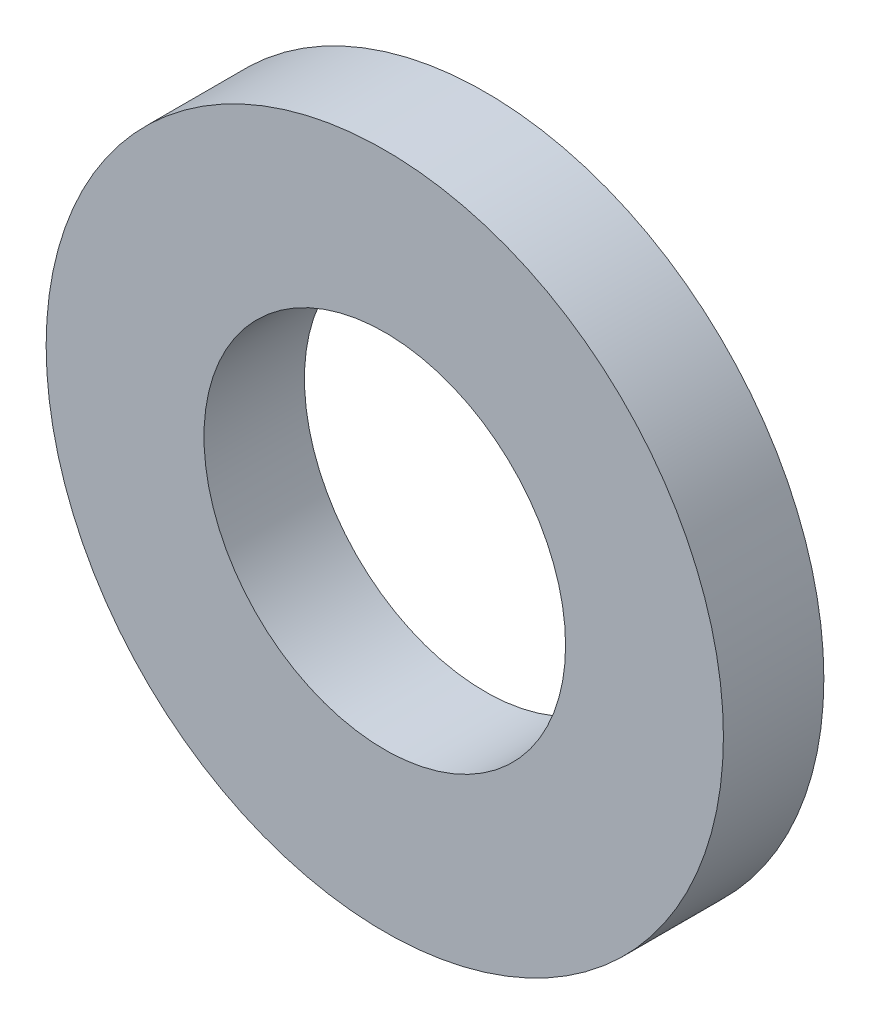
ISO-10303-21;
HEADER;
FILE_DESCRIPTION(('STEP AP214'),'2;1');
FILE_NAME('part.step','',(''),(''),'','','');
FILE_SCHEMA(('AUTOMOTIVE_DESIGN { 1 0 10303 214 1 1 1 1 }'));
ENDSEC;
DATA;
#1=APPLICATION_CONTEXT('core data for automotive mechanical design processes');
#2=APPLICATION_PROTOCOL_DEFINITION('international standard','automotive_design',2000,#1);
#3=PRODUCT_CONTEXT('',#1,'mechanical');
#4=PRODUCT('Part','Part','',(#3));
#5=PRODUCT_RELATED_PRODUCT_CATEGORY('part','',(#4));
#6=PRODUCT_DEFINITION_FORMATION('','',#4);
#7=PRODUCT_DEFINITION_CONTEXT('part definition',#1,'design');
#8=PRODUCT_DEFINITION('design','',#6,#7);
#9=PRODUCT_DEFINITION_SHAPE('','',#8);
#10=(LENGTH_UNIT() NAMED_UNIT(*) SI_UNIT(.MILLI.,.METRE.));
#11=(NAMED_UNIT(*) PLANE_ANGLE_UNIT() SI_UNIT($,.RADIAN.));
#12=(NAMED_UNIT(*) SI_UNIT($,.STERADIAN.) SOLID_ANGLE_UNIT());
#13=UNCERTAINTY_MEASURE_WITH_UNIT(LENGTH_MEASURE(1.E-05),#10,'distance_accuracy_value','');
#14=(GEOMETRIC_REPRESENTATION_CONTEXT(3) GLOBAL_UNCERTAINTY_ASSIGNED_CONTEXT((#13)) GLOBAL_UNIT_ASSIGNED_CONTEXT((#10,
#11,#12)) REPRESENTATION_CONTEXT('',''));
#15=CARTESIAN_POINT('',(0.,0.,0.));
#16=DIRECTION('',(0.,0.,1.));
#17=DIRECTION('',(1.,0.,0.));
#18=AXIS2_PLACEMENT_3D('',#15,#16,#17);
#19=CARTESIAN_POINT('',(0.,0.,0.888999999999999));
#20=DIRECTION('',(0.,0.,1.));
#21=DIRECTION('',(1.,0.,0.));
#22=AXIS2_PLACEMENT_3D('',#19,#20,#21);
#23=PLANE('',#22);
#24=CARTESIAN_POINT('',(0.,0.,0.888999999999999));
#25=DIRECTION('',(0.,0.,1.));
#26=DIRECTION('',(1.,0.,0.));
#27=AXIS2_PLACEMENT_3D('',#24,#25,#26);
#28=CIRCLE('',#27,5.9944);
#29=CARTESIAN_POINT('',(5.9944,0.,0.888999999999999));
#30=VERTEX_POINT('',#29);
#31=EDGE_CURVE('E10',#30,#30,#28,.T.);
#32=ORIENTED_EDGE('',*,*,#31,.T.);
#33=EDGE_LOOP('',(#32));
#34=FACE_BOUND('',#33,.T.);
#35=CARTESIAN_POINT('',(0.,0.,0.888999999999999));
#36=DIRECTION('',(0.,0.,1.));
#37=DIRECTION('',(1.,0.,0.));
#38=AXIS2_PLACEMENT_3D('',#35,#36,#37);
#39=CIRCLE('',#38,3.2004);
#40=CARTESIAN_POINT('',(3.2004,0.,0.888999999999999));
#41=VERTEX_POINT('',#40);
#42=EDGE_CURVE('E37',#41,#41,#39,.T.);
#43=ORIENTED_EDGE('',*,*,#42,.F.);
#44=EDGE_LOOP('',(#43));
#45=FACE_BOUND('',#44,.T.);
#46=ADVANCED_FACE('F30',(#34,#45),#23,.T.);
#47=CARTESIAN_POINT('',(0.,0.,0.888999999999999));
#48=DIRECTION('',(0.,0.,-1.));
#49=DIRECTION('',(-1.,0.,0.));
#50=AXIS2_PLACEMENT_3D('',#47,#48,#49);
#51=CYLINDRICAL_SURFACE('',#50,5.9944);
#52=ORIENTED_EDGE('',*,*,#31,.F.);
#53=EDGE_LOOP('',(#52));
#54=FACE_BOUND('',#53,.T.);
#55=CARTESIAN_POINT('',(0.,0.,-0.889000000000001));
#56=DIRECTION('',(0.,0.,1.));
#57=DIRECTION('',(1.,0.,0.));
#58=AXIS2_PLACEMENT_3D('',#55,#56,#57);
#59=CIRCLE('',#58,5.9944);
#60=CARTESIAN_POINT('',(5.9944,0.,-0.889000000000001));
#61=VERTEX_POINT('',#60);
#62=EDGE_CURVE('E41',#61,#61,#59,.T.);
#63=ORIENTED_EDGE('',*,*,#62,.T.);
#64=EDGE_LOOP('',(#63));
#65=FACE_BOUND('',#64,.T.);
#66=ADVANCED_FACE('F32',(#54,#65),#51,.T.);
#67=CARTESIAN_POINT('',(0.,0.,0.888999999999999));
#68=DIRECTION('',(0.,0.,-1.));
#69=DIRECTION('',(-1.,0.,0.));
#70=AXIS2_PLACEMENT_3D('',#67,#68,#69);
#71=CYLINDRICAL_SURFACE('',#70,3.2004);
#72=ORIENTED_EDGE('',*,*,#42,.T.);
#73=EDGE_LOOP('',(#72));
#74=FACE_BOUND('',#73,.T.);
#75=CARTESIAN_POINT('',(0.,0.,-0.889000000000001));
#76=DIRECTION('',(0.,0.,1.));
#77=DIRECTION('',(1.,0.,0.));
#78=AXIS2_PLACEMENT_3D('',#75,#76,#77);
#79=CIRCLE('',#78,3.2004);
#80=CARTESIAN_POINT('',(3.2004,0.,-0.889000000000001));
#81=VERTEX_POINT('',#80);
#82=EDGE_CURVE('E45',#81,#81,#79,.T.);
#83=ORIENTED_EDGE('',*,*,#82,.F.);
#84=EDGE_LOOP('',(#83));
#85=FACE_BOUND('',#84,.T.);
#86=ADVANCED_FACE('F54',(#74,#85),#71,.F.);
#87=CARTESIAN_POINT('',(0.,0.,-0.889000000000001));
#88=DIRECTION('',(0.,0.,1.));
#89=DIRECTION('',(1.,0.,0.));
#90=AXIS2_PLACEMENT_3D('',#87,#88,#89);
#91=PLANE('',#90);
#92=ORIENTED_EDGE('',*,*,#82,.T.);
#93=EDGE_LOOP('',(#92));
#94=FACE_BOUND('',#93,.T.);
#95=ORIENTED_EDGE('',*,*,#62,.F.);
#96=EDGE_LOOP('',(#95));
#97=FACE_BOUND('',#96,.T.);
#98=ADVANCED_FACE('F51',(#94,#97),#91,.F.);
#99=CLOSED_SHELL('',(#46,#66,#86,#98));
#100=MANIFOLD_SOLID_BREP('B2',#99);
#101=ADVANCED_BREP_SHAPE_REPRESENTATION('',(#18,#100),#14);
#102=SHAPE_DEFINITION_REPRESENTATION(#9,#101);
ENDSEC;
END-ISO-10303-21;
